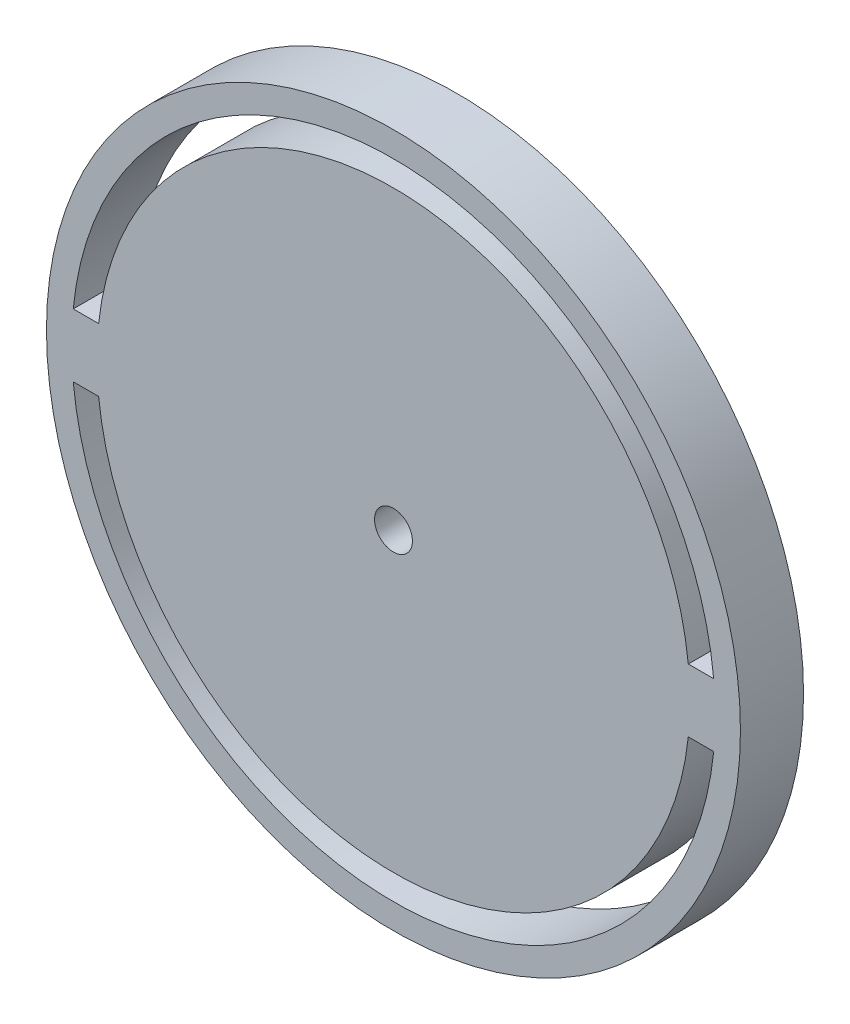
ISO-10303-21;
HEADER;
FILE_DESCRIPTION(('STEP AP214'),'2;1');
FILE_NAME('part.step','',(''),(''),'','','');
FILE_SCHEMA(('AUTOMOTIVE_DESIGN { 1 0 10303 214 1 1 1 1 }'));
ENDSEC;
DATA;
#1=APPLICATION_CONTEXT('core data for automotive mechanical design processes');
#2=APPLICATION_PROTOCOL_DEFINITION('international standard','automotive_design',2000,#1);
#3=PRODUCT_CONTEXT('',#1,'mechanical');
#4=PRODUCT('Part','Part','',(#3));
#5=PRODUCT_RELATED_PRODUCT_CATEGORY('part','',(#4));
#6=PRODUCT_DEFINITION_FORMATION('','',#4);
#7=PRODUCT_DEFINITION_CONTEXT('part definition',#1,'design');
#8=PRODUCT_DEFINITION('design','',#6,#7);
#9=PRODUCT_DEFINITION_SHAPE('','',#8);
#10=(LENGTH_UNIT() NAMED_UNIT(*) SI_UNIT(.MILLI.,.METRE.));
#11=(NAMED_UNIT(*) PLANE_ANGLE_UNIT() SI_UNIT($,.RADIAN.));
#12=(NAMED_UNIT(*) SI_UNIT($,.STERADIAN.) SOLID_ANGLE_UNIT());
#13=UNCERTAINTY_MEASURE_WITH_UNIT(LENGTH_MEASURE(1.E-05),#10,'distance_accuracy_value','');
#14=(GEOMETRIC_REPRESENTATION_CONTEXT(3) GLOBAL_UNCERTAINTY_ASSIGNED_CONTEXT((#13)) GLOBAL_UNIT_ASSIGNED_CONTEXT((#10,
#11,#12)) REPRESENTATION_CONTEXT('',''));
#15=CARTESIAN_POINT('',(0.,0.,0.));
#16=DIRECTION('',(0.,0.,1.));
#17=DIRECTION('',(1.,0.,0.));
#18=AXIS2_PLACEMENT_3D('',#15,#16,#17);
#19=CARTESIAN_POINT('',(0.,0.,10.));
#20=DIRECTION('',(0.,0.,1.));
#21=DIRECTION('',(1.,0.,0.));
#22=AXIS2_PLACEMENT_3D('',#19,#20,#21);
#23=PLANE('',#22);
#24=CARTESIAN_POINT('',(0.,0.,10.));
#25=DIRECTION('',(0.,0.,1.));
#26=DIRECTION('',(1.,0.,0.));
#27=AXIS2_PLACEMENT_3D('',#24,#25,#26);
#28=CIRCLE('',#27,51.);
#29=CARTESIAN_POINT('',(50.754310161798,5.00000000000003,10.));
#30=VERTEX_POINT('',#29);
#31=CARTESIAN_POINT('',(-50.7543101617981,4.99999999999999,10.));
#32=VERTEX_POINT('',#31);
#33=EDGE_CURVE('E48',#30,#32,#28,.T.);
#34=ORIENTED_EDGE('',*,*,#33,.F.);
#35=DIRECTION('',(1.,0.,0.));
#36=VECTOR('',#35,1.);
#37=CARTESIAN_POINT('',(46.7332857821917,5.00000000000002,10.));
#38=LINE('',#37,#36);
#39=CARTESIAN_POINT('',(46.7332857821917,5.00000000000002,10.));
#40=VERTEX_POINT('',#39);
#41=EDGE_CURVE('E116',#40,#30,#38,.T.);
#42=ORIENTED_EDGE('',*,*,#41,.F.);
#43=CARTESIAN_POINT('',(0.,0.,10.));
#44=DIRECTION('',(0.,0.,-1.));
#45=DIRECTION('',(1.,0.,0.));
#46=AXIS2_PLACEMENT_3D('',#43,#44,#45);
#47=CIRCLE('',#46,47.);
#48=CARTESIAN_POINT('',(-46.7332857821917,4.99999999999999,10.));
#49=VERTEX_POINT('',#48);
#50=EDGE_CURVE('E119',#49,#40,#47,.T.);
#51=ORIENTED_EDGE('',*,*,#50,.F.);
#52=DIRECTION('',(1.,0.,0.));
#53=VECTOR('',#52,1.);
#54=CARTESIAN_POINT('',(-50.7543101617981,4.99999999999999,10.));
#55=LINE('',#54,#53);
#56=EDGE_CURVE('E125',#32,#49,#55,.T.);
#57=ORIENTED_EDGE('',*,*,#56,.F.);
#58=EDGE_LOOP('',(#34,#42,#51,#57));
#59=FACE_BOUND('',#58,.T.);
#60=CARTESIAN_POINT('',(0.,0.,10.));
#61=DIRECTION('',(0.,0.,1.));
#62=DIRECTION('',(1.,0.,0.));
#63=AXIS2_PLACEMENT_3D('',#60,#61,#62);
#64=CIRCLE('',#63,51.);
#65=CARTESIAN_POINT('',(-50.7543101617981,-5.,10.));
#66=VERTEX_POINT('',#65);
#67=CARTESIAN_POINT('',(50.7543101617981,-5.,10.));
#68=VERTEX_POINT('',#67);
#69=EDGE_CURVE('E131',#66,#68,#64,.T.);
#70=ORIENTED_EDGE('',*,*,#69,.F.);
#71=DIRECTION('',(-1.,0.,0.));
#72=VECTOR('',#71,1.);
#73=CARTESIAN_POINT('',(-50.7543101617981,-5.,10.));
#74=LINE('',#73,#72);
#75=CARTESIAN_POINT('',(-46.7332857821917,-5.,10.));
#76=VERTEX_POINT('',#75);
#77=EDGE_CURVE('E139',#76,#66,#74,.T.);
#78=ORIENTED_EDGE('',*,*,#77,.F.);
#79=CARTESIAN_POINT('',(0.,0.,10.));
#80=DIRECTION('',(0.,0.,-1.));
#81=DIRECTION('',(1.,0.,0.));
#82=AXIS2_PLACEMENT_3D('',#79,#80,#81);
#83=CIRCLE('',#82,47.);
#84=CARTESIAN_POINT('',(46.7332857821917,-5.00000000000001,10.));
#85=VERTEX_POINT('',#84);
#86=EDGE_CURVE('E153',#85,#76,#83,.T.);
#87=ORIENTED_EDGE('',*,*,#86,.F.);
#88=DIRECTION('',(-1.,0.,0.));
#89=VECTOR('',#88,1.);
#90=CARTESIAN_POINT('',(46.7332857821917,-5.,10.));
#91=LINE('',#90,#89);
#92=EDGE_CURVE('E150',#68,#85,#91,.T.);
#93=ORIENTED_EDGE('',*,*,#92,.F.);
#94=EDGE_LOOP('',(#70,#78,#87,#93));
#95=FACE_BOUND('',#94,.T.);
#96=CARTESIAN_POINT('',(0.,0.,10.));
#97=DIRECTION('',(0.,0.,1.));
#98=DIRECTION('',(1.,0.,0.));
#99=AXIS2_PLACEMENT_3D('',#96,#97,#98);
#100=CIRCLE('',#99,55.);
#101=CARTESIAN_POINT('',(55.,0.,10.));
#102=VERTEX_POINT('',#101);
#103=EDGE_CURVE('E11',#102,#102,#100,.T.);
#104=ORIENTED_EDGE('',*,*,#103,.T.);
#105=EDGE_LOOP('',(#104));
#106=FACE_BOUND('',#105,.T.);
#107=CARTESIAN_POINT('',(0.,0.,10.));
#108=DIRECTION('',(0.,0.,1.));
#109=DIRECTION('',(1.,0.,0.));
#110=AXIS2_PLACEMENT_3D('',#107,#108,#109);
#111=CIRCLE('',#110,3.);
#112=CARTESIAN_POINT('',(3.,0.,10.));
#113=VERTEX_POINT('',#112);
#114=EDGE_CURVE('E167',#113,#113,#111,.T.);
#115=ORIENTED_EDGE('',*,*,#114,.F.);
#116=EDGE_LOOP('',(#115));
#117=FACE_BOUND('',#116,.T.);
#118=ADVANCED_FACE('F33',(#59,#95,#106,#117),#23,.T.);
#119=CARTESIAN_POINT('',(0.,0.,0.));
#120=DIRECTION('',(0.,0.,1.));
#121=DIRECTION('',(1.,0.,0.));
#122=AXIS2_PLACEMENT_3D('',#119,#120,#121);
#123=PLANE('',#122);
#124=DIRECTION('',(1.,0.,0.));
#125=VECTOR('',#124,1.);
#126=CARTESIAN_POINT('',(46.7332857821917,5.00000000000002,0.));
#127=LINE('',#126,#125);
#128=CARTESIAN_POINT('',(46.7332857821917,5.00000000000002,0.));
#129=VERTEX_POINT('',#128);
#130=CARTESIAN_POINT('',(50.754310161798,5.00000000000003,0.));
#131=VERTEX_POINT('',#130);
#132=EDGE_CURVE('E106',#129,#131,#127,.T.);
#133=ORIENTED_EDGE('',*,*,#132,.T.);
#134=CARTESIAN_POINT('',(0.,0.,0.));
#135=DIRECTION('',(0.,0.,1.));
#136=DIRECTION('',(1.,0.,0.));
#137=AXIS2_PLACEMENT_3D('',#134,#135,#136);
#138=CIRCLE('',#137,51.);
#139=CARTESIAN_POINT('',(-50.7543101617981,4.99999999999999,0.));
#140=VERTEX_POINT('',#139);
#141=EDGE_CURVE('E100',#131,#140,#138,.T.);
#142=ORIENTED_EDGE('',*,*,#141,.T.);
#143=DIRECTION('',(1.,0.,0.));
#144=VECTOR('',#143,1.);
#145=CARTESIAN_POINT('',(-50.7543101617981,4.99999999999999,0.));
#146=LINE('',#145,#144);
#147=CARTESIAN_POINT('',(-46.7332857821917,4.99999999999999,0.));
#148=VERTEX_POINT('',#147);
#149=EDGE_CURVE('E109',#140,#148,#146,.T.);
#150=ORIENTED_EDGE('',*,*,#149,.T.);
#151=CARTESIAN_POINT('',(0.,0.,0.));
#152=DIRECTION('',(0.,0.,-1.));
#153=DIRECTION('',(1.,0.,0.));
#154=AXIS2_PLACEMENT_3D('',#151,#152,#153);
#155=CIRCLE('',#154,47.);
#156=EDGE_CURVE('E56',#148,#129,#155,.T.);
#157=ORIENTED_EDGE('',*,*,#156,.T.);
#158=EDGE_LOOP('',(#133,#142,#150,#157));
#159=FACE_BOUND('',#158,.T.);
#160=DIRECTION('',(-1.,0.,0.));
#161=VECTOR('',#160,1.);
#162=CARTESIAN_POINT('',(-50.7543101617981,-5.,0.));
#163=LINE('',#162,#161);
#164=CARTESIAN_POINT('',(-46.7332857821917,-5.,0.));
#165=VERTEX_POINT('',#164);
#166=CARTESIAN_POINT('',(-50.7543101617981,-5.,0.));
#167=VERTEX_POINT('',#166);
#168=EDGE_CURVE('E145',#165,#167,#163,.T.);
#169=ORIENTED_EDGE('',*,*,#168,.T.);
#170=CARTESIAN_POINT('',(0.,0.,0.));
#171=DIRECTION('',(0.,0.,1.));
#172=DIRECTION('',(1.,0.,0.));
#173=AXIS2_PLACEMENT_3D('',#170,#171,#172);
#174=CIRCLE('',#173,51.);
#175=CARTESIAN_POINT('',(50.7543101617981,-5.,0.));
#176=VERTEX_POINT('',#175);
#177=EDGE_CURVE('E135',#167,#176,#174,.T.);
#178=ORIENTED_EDGE('',*,*,#177,.T.);
#179=DIRECTION('',(-1.,0.,0.));
#180=VECTOR('',#179,1.);
#181=CARTESIAN_POINT('',(46.7332857821917,-5.,0.));
#182=LINE('',#181,#180);
#183=CARTESIAN_POINT('',(46.7332857821917,-5.,0.));
#184=VERTEX_POINT('',#183);
#185=EDGE_CURVE('E138',#176,#184,#182,.T.);
#186=ORIENTED_EDGE('',*,*,#185,.T.);
#187=CARTESIAN_POINT('',(0.,0.,0.));
#188=DIRECTION('',(0.,0.,-1.));
#189=DIRECTION('',(1.,0.,0.));
#190=AXIS2_PLACEMENT_3D('',#187,#188,#189);
#191=CIRCLE('',#190,47.);
#192=EDGE_CURVE('E142',#184,#165,#191,.T.);
#193=ORIENTED_EDGE('',*,*,#192,.T.);
#194=EDGE_LOOP('',(#169,#178,#186,#193));
#195=FACE_BOUND('',#194,.T.);
#196=CARTESIAN_POINT('',(0.,0.,0.));
#197=DIRECTION('',(0.,0.,1.));
#198=DIRECTION('',(1.,0.,0.));
#199=AXIS2_PLACEMENT_3D('',#196,#197,#198);
#200=CIRCLE('',#199,55.);
#201=CARTESIAN_POINT('',(55.,0.,0.));
#202=VERTEX_POINT('',#201);
#203=EDGE_CURVE('E37',#202,#202,#200,.T.);
#204=ORIENTED_EDGE('',*,*,#203,.F.);
#205=EDGE_LOOP('',(#204));
#206=FACE_BOUND('',#205,.T.);
#207=CARTESIAN_POINT('',(0.,0.,0.));
#208=DIRECTION('',(0.,0.,1.));
#209=DIRECTION('',(1.,0.,0.));
#210=AXIS2_PLACEMENT_3D('',#207,#208,#209);
#211=CIRCLE('',#210,3.);
#212=CARTESIAN_POINT('',(3.,0.,0.));
#213=VERTEX_POINT('',#212);
#214=EDGE_CURVE('E160',#213,#213,#211,.T.);
#215=ORIENTED_EDGE('',*,*,#214,.T.);
#216=EDGE_LOOP('',(#215));
#217=FACE_BOUND('',#216,.T.);
#218=ADVANCED_FACE('F113',(#159,#195,#206,#217),#123,.F.);
#219=CARTESIAN_POINT('',(0.,0.,10.));
#220=DIRECTION('',(0.,0.,-1.));
#221=DIRECTION('',(-1.,0.,0.));
#222=AXIS2_PLACEMENT_3D('',#219,#220,#221);
#223=CYLINDRICAL_SURFACE('',#222,55.);
#224=ORIENTED_EDGE('',*,*,#103,.F.);
#225=EDGE_LOOP('',(#224));
#226=FACE_BOUND('',#225,.T.);
#227=ORIENTED_EDGE('',*,*,#203,.T.);
#228=EDGE_LOOP('',(#227));
#229=FACE_BOUND('',#228,.T.);
#230=ADVANCED_FACE('F35',(#226,#229),#223,.T.);
#231=CARTESIAN_POINT('',(0.,0.,10.));
#232=DIRECTION('',(0.,0.,-1.));
#233=DIRECTION('',(-1.,0.,0.));
#234=AXIS2_PLACEMENT_3D('',#231,#232,#233);
#235=CYLINDRICAL_SURFACE('',#234,3.);
#236=ORIENTED_EDGE('',*,*,#114,.T.);
#237=EDGE_LOOP('',(#236));
#238=FACE_BOUND('',#237,.T.);
#239=ORIENTED_EDGE('',*,*,#214,.F.);
#240=EDGE_LOOP('',(#239));
#241=FACE_BOUND('',#240,.T.);
#242=ADVANCED_FACE('F174',(#238,#241),#235,.F.);
#243=CARTESIAN_POINT('',(0.,0.,0.));
#244=DIRECTION('',(0.,0.,1.));
#245=DIRECTION('',(1.,0.,0.));
#246=AXIS2_PLACEMENT_3D('',#243,#244,#245);
#247=CYLINDRICAL_SURFACE('',#246,51.);
#248=ORIENTED_EDGE('',*,*,#69,.T.);
#249=DIRECTION('',(0.,0.,1.));
#250=VECTOR('',#249,1.);
#251=CARTESIAN_POINT('',(50.7543101617981,-5.,0.));
#252=LINE('',#251,#250);
#253=EDGE_CURVE('E148',#176,#68,#252,.T.);
#254=ORIENTED_EDGE('',*,*,#253,.F.);
#255=ORIENTED_EDGE('',*,*,#177,.F.);
#256=DIRECTION('',(0.,0.,1.));
#257=VECTOR('',#256,1.);
#258=CARTESIAN_POINT('',(-50.7543101617981,-5.,0.));
#259=LINE('',#258,#257);
#260=EDGE_CURVE('E158',#167,#66,#259,.T.);
#261=ORIENTED_EDGE('',*,*,#260,.T.);
#262=EDGE_LOOP('',(#248,#254,#255,#261));
#263=FACE_BOUND('',#262,.T.);
#264=ADVANCED_FACE('F176',(#263),#247,.F.);
#265=CARTESIAN_POINT('',(-50.7543101617981,-5.,0.));
#266=DIRECTION('',(0.,1.,0.));
#267=DIRECTION('',(0.,0.,1.));
#268=AXIS2_PLACEMENT_3D('',#265,#266,#267);
#269=PLANE('',#268);
#270=ORIENTED_EDGE('',*,*,#77,.T.);
#271=ORIENTED_EDGE('',*,*,#260,.F.);
#272=ORIENTED_EDGE('',*,*,#168,.F.);
#273=DIRECTION('',(0.,0.,1.));
#274=VECTOR('',#273,1.);
#275=CARTESIAN_POINT('',(-46.7332857821917,-5.,0.));
#276=LINE('',#275,#274);
#277=EDGE_CURVE('E161',#165,#76,#276,.T.);
#278=ORIENTED_EDGE('',*,*,#277,.T.);
#279=EDGE_LOOP('',(#270,#271,#272,#278));
#280=FACE_BOUND('',#279,.T.);
#281=ADVANCED_FACE('F183',(#280),#269,.F.);
#282=CARTESIAN_POINT('',(0.,0.,0.));
#283=DIRECTION('',(0.,0.,1.));
#284=DIRECTION('',(1.,0.,0.));
#285=AXIS2_PLACEMENT_3D('',#282,#283,#284);
#286=CYLINDRICAL_SURFACE('',#285,47.);
#287=ORIENTED_EDGE('',*,*,#86,.T.);
#288=ORIENTED_EDGE('',*,*,#277,.F.);
#289=ORIENTED_EDGE('',*,*,#192,.F.);
#290=DIRECTION('',(0.,0.,1.));
#291=VECTOR('',#290,1.);
#292=CARTESIAN_POINT('',(46.7332857821917,-5.00000000000001,0.));
#293=LINE('',#292,#291);
#294=EDGE_CURVE('E163',#184,#85,#293,.T.);
#295=ORIENTED_EDGE('',*,*,#294,.T.);
#296=EDGE_LOOP('',(#287,#288,#289,#295));
#297=FACE_BOUND('',#296,.T.);
#298=ADVANCED_FACE('F215',(#297),#286,.T.);
#299=CARTESIAN_POINT('',(46.7332857821917,-5.,0.));
#300=DIRECTION('',(0.,1.,0.));
#301=DIRECTION('',(0.,0.,1.));
#302=AXIS2_PLACEMENT_3D('',#299,#300,#301);
#303=PLANE('',#302);
#304=ORIENTED_EDGE('',*,*,#92,.T.);
#305=ORIENTED_EDGE('',*,*,#294,.F.);
#306=ORIENTED_EDGE('',*,*,#185,.F.);
#307=ORIENTED_EDGE('',*,*,#253,.T.);
#308=EDGE_LOOP('',(#304,#305,#306,#307));
#309=FACE_BOUND('',#308,.T.);
#310=ADVANCED_FACE('F210',(#309),#303,.F.);
#311=CARTESIAN_POINT('',(0.,0.,0.));
#312=DIRECTION('',(0.,0.,1.));
#313=DIRECTION('',(1.,0.,0.));
#314=AXIS2_PLACEMENT_3D('',#311,#312,#313);
#315=CYLINDRICAL_SURFACE('',#314,51.);
#316=ORIENTED_EDGE('',*,*,#33,.T.);
#317=DIRECTION('',(0.,0.,1.));
#318=VECTOR('',#317,1.);
#319=CARTESIAN_POINT('',(-50.7543101617981,4.99999999999999,0.));
#320=LINE('',#319,#318);
#321=EDGE_CURVE('E96',#140,#32,#320,.T.);
#322=ORIENTED_EDGE('',*,*,#321,.F.);
#323=ORIENTED_EDGE('',*,*,#141,.F.);
#324=DIRECTION('',(0.,0.,1.));
#325=VECTOR('',#324,1.);
#326=CARTESIAN_POINT('',(50.754310161798,5.00000000000003,0.));
#327=LINE('',#326,#325);
#328=EDGE_CURVE('E129',#131,#30,#327,.T.);
#329=ORIENTED_EDGE('',*,*,#328,.T.);
#330=EDGE_LOOP('',(#316,#322,#323,#329));
#331=FACE_BOUND('',#330,.T.);
#332=ADVANCED_FACE('F98',(#331),#315,.F.);
#333=CARTESIAN_POINT('',(46.7332857821917,5.00000000000002,0.));
#334=DIRECTION('',(0.,-1.,0.));
#335=DIRECTION('',(1.,0.,0.));
#336=AXIS2_PLACEMENT_3D('',#333,#334,#335);
#337=PLANE('',#336);
#338=ORIENTED_EDGE('',*,*,#41,.T.);
#339=ORIENTED_EDGE('',*,*,#328,.F.);
#340=ORIENTED_EDGE('',*,*,#132,.F.);
#341=DIRECTION('',(0.,0.,1.));
#342=VECTOR('',#341,1.);
#343=CARTESIAN_POINT('',(46.7332857821917,5.00000000000002,0.));
#344=LINE('',#343,#342);
#345=EDGE_CURVE('E132',#129,#40,#344,.T.);
#346=ORIENTED_EDGE('',*,*,#345,.T.);
#347=EDGE_LOOP('',(#338,#339,#340,#346));
#348=FACE_BOUND('',#347,.T.);
#349=ADVANCED_FACE('F227',(#348),#337,.F.);
#350=CARTESIAN_POINT('',(0.,0.,0.));
#351=DIRECTION('',(0.,0.,1.));
#352=DIRECTION('',(1.,0.,0.));
#353=AXIS2_PLACEMENT_3D('',#350,#351,#352);
#354=CYLINDRICAL_SURFACE('',#353,47.);
#355=ORIENTED_EDGE('',*,*,#50,.T.);
#356=ORIENTED_EDGE('',*,*,#345,.F.);
#357=ORIENTED_EDGE('',*,*,#156,.F.);
#358=DIRECTION('',(0.,0.,1.));
#359=VECTOR('',#358,1.);
#360=CARTESIAN_POINT('',(-46.7332857821917,4.99999999999999,0.));
#361=LINE('',#360,#359);
#362=EDGE_CURVE('E105',#148,#49,#361,.T.);
#363=ORIENTED_EDGE('',*,*,#362,.T.);
#364=EDGE_LOOP('',(#355,#356,#357,#363));
#365=FACE_BOUND('',#364,.T.);
#366=ADVANCED_FACE('F230',(#365),#354,.T.);
#367=CARTESIAN_POINT('',(-50.7543101617981,4.99999999999999,0.));
#368=DIRECTION('',(0.,-1.,0.));
#369=DIRECTION('',(0.,0.,-1.));
#370=AXIS2_PLACEMENT_3D('',#367,#368,#369);
#371=PLANE('',#370);
#372=ORIENTED_EDGE('',*,*,#56,.T.);
#373=ORIENTED_EDGE('',*,*,#362,.F.);
#374=ORIENTED_EDGE('',*,*,#149,.F.);
#375=ORIENTED_EDGE('',*,*,#321,.T.);
#376=EDGE_LOOP('',(#372,#373,#374,#375));
#377=FACE_BOUND('',#376,.T.);
#378=ADVANCED_FACE('F110',(#377),#371,.F.);
#379=CLOSED_SHELL('',(#118,#218,#230,#242,#264,#281,#298,#310,#332,#349,#366,#378));
#380=MANIFOLD_SOLID_BREP('B2',#379);
#381=ADVANCED_BREP_SHAPE_REPRESENTATION('',(#18,#380),#14);
#382=SHAPE_DEFINITION_REPRESENTATION(#9,#381);
ENDSEC;
END-ISO-10303-21;
